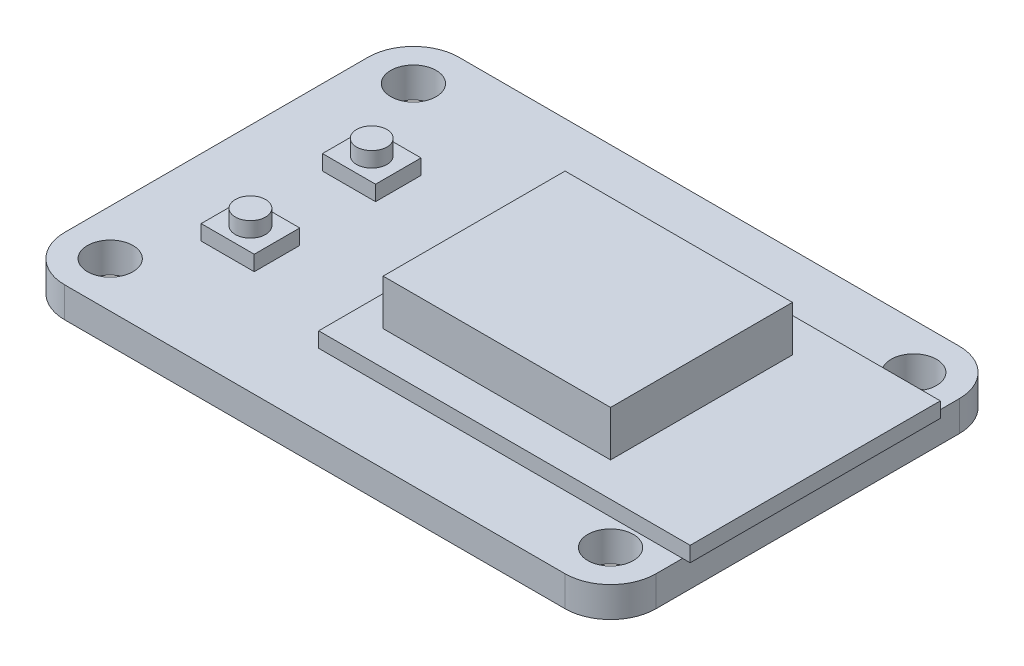
ISO-10303-21;
HEADER;
FILE_DESCRIPTION(('STEP AP214'),'2;1');
FILE_NAME('part.step','',(''),(''),'','','');
FILE_SCHEMA(('AUTOMOTIVE_DESIGN { 1 0 10303 214 1 1 1 1 }'));
ENDSEC;
DATA;
#1=APPLICATION_CONTEXT('core data for automotive mechanical design processes');
#2=APPLICATION_PROTOCOL_DEFINITION('international standard','automotive_design',2000,#1);
#3=PRODUCT_CONTEXT('',#1,'mechanical');
#4=PRODUCT('Part','Part','',(#3));
#5=PRODUCT_RELATED_PRODUCT_CATEGORY('part','',(#4));
#6=PRODUCT_DEFINITION_FORMATION('','',#4);
#7=PRODUCT_DEFINITION_CONTEXT('part definition',#1,'design');
#8=PRODUCT_DEFINITION('design','',#6,#7);
#9=PRODUCT_DEFINITION_SHAPE('','',#8);
#10=(LENGTH_UNIT() NAMED_UNIT(*) SI_UNIT(.MILLI.,.METRE.));
#11=(NAMED_UNIT(*) PLANE_ANGLE_UNIT() SI_UNIT($,.RADIAN.));
#12=(NAMED_UNIT(*) SI_UNIT($,.STERADIAN.) SOLID_ANGLE_UNIT());
#13=UNCERTAINTY_MEASURE_WITH_UNIT(LENGTH_MEASURE(1.E-05),#10,'distance_accuracy_value','');
#14=(GEOMETRIC_REPRESENTATION_CONTEXT(3) GLOBAL_UNCERTAINTY_ASSIGNED_CONTEXT((#13)) GLOBAL_UNIT_ASSIGNED_CONTEXT((#10,
#11,#12)) REPRESENTATION_CONTEXT('',''));
#15=CARTESIAN_POINT('',(0.,0.,0.));
#16=DIRECTION('',(0.,0.,1.));
#17=DIRECTION('',(1.,0.,0.));
#18=AXIS2_PLACEMENT_3D('',#15,#16,#17);
#19=CARTESIAN_POINT('',(0.,2.,0.));
#20=DIRECTION('',(0.,1.,0.));
#21=DIRECTION('',(0.,0.,1.));
#22=AXIS2_PLACEMENT_3D('',#19,#20,#21);
#23=PLANE('',#22);
#24=DIRECTION('',(0.,0.,-1.));
#25=VECTOR('',#24,1.);
#26=CARTESIAN_POINT('',(19.5,2.,-13.));
#27=LINE('',#26,#25);
#28=CARTESIAN_POINT('',(19.5,2.,-8.25));
#29=VERTEX_POINT('',#28);
#30=CARTESIAN_POINT('',(19.5,2.,-10.));
#31=VERTEX_POINT('',#30);
#32=EDGE_CURVE('E356',#29,#31,#27,.T.);
#33=ORIENTED_EDGE('',*,*,#32,.T.);
#34=CARTESIAN_POINT('',(16.5,2.,-10.));
#35=DIRECTION('',(0.,1.,0.));
#36=DIRECTION('',(0.,0.,1.));
#37=AXIS2_PLACEMENT_3D('',#34,#35,#36);
#38=CIRCLE('',#37,3.);
#39=CARTESIAN_POINT('',(16.5,2.,-13.));
#40=VERTEX_POINT('',#39);
#41=EDGE_CURVE('E396',#31,#40,#38,.T.);
#42=ORIENTED_EDGE('',*,*,#41,.T.);
#43=DIRECTION('',(-1.,0.,0.));
#44=VECTOR('',#43,1.);
#45=CARTESIAN_POINT('',(-19.5,2.,-13.));
#46=LINE('',#45,#44);
#47=CARTESIAN_POINT('',(-16.5,2.,-13.));
#48=VERTEX_POINT('',#47);
#49=EDGE_CURVE('E354',#40,#48,#46,.T.);
#50=ORIENTED_EDGE('',*,*,#49,.T.);
#51=CARTESIAN_POINT('',(-16.5,2.,-10.));
#52=DIRECTION('',(0.,1.,0.));
#53=DIRECTION('',(0.,0.,1.));
#54=AXIS2_PLACEMENT_3D('',#51,#52,#53);
#55=CIRCLE('',#54,3.);
#56=CARTESIAN_POINT('',(-19.5,2.,-10.));
#57=VERTEX_POINT('',#56);
#58=EDGE_CURVE('E392',#48,#57,#55,.T.);
#59=ORIENTED_EDGE('',*,*,#58,.T.);
#60=DIRECTION('',(0.,0.,1.));
#61=VECTOR('',#60,1.);
#62=CARTESIAN_POINT('',(-19.5,2.,-13.));
#63=LINE('',#62,#61);
#64=CARTESIAN_POINT('',(-19.5,2.,9.99999999999999));
#65=VERTEX_POINT('',#64);
#66=EDGE_CURVE('E359',#57,#65,#63,.T.);
#67=ORIENTED_EDGE('',*,*,#66,.T.);
#68=CARTESIAN_POINT('',(-16.5,2.,10.));
#69=DIRECTION('',(0.,1.,0.));
#70=DIRECTION('',(0.,0.,1.));
#71=AXIS2_PLACEMENT_3D('',#68,#69,#70);
#72=CIRCLE('',#71,3.);
#73=CARTESIAN_POINT('',(-16.5,2.,13.));
#74=VERTEX_POINT('',#73);
#75=EDGE_CURVE('E57',#65,#74,#72,.T.);
#76=ORIENTED_EDGE('',*,*,#75,.T.);
#77=DIRECTION('',(1.,0.,0.));
#78=VECTOR('',#77,1.);
#79=CARTESIAN_POINT('',(-19.5,2.,13.));
#80=LINE('',#79,#78);
#81=CARTESIAN_POINT('',(16.5,2.,13.));
#82=VERTEX_POINT('',#81);
#83=EDGE_CURVE('E361',#74,#82,#80,.T.);
#84=ORIENTED_EDGE('',*,*,#83,.T.);
#85=CARTESIAN_POINT('',(16.5,2.,10.));
#86=DIRECTION('',(0.,1.,0.));
#87=DIRECTION('',(0.,0.,1.));
#88=AXIS2_PLACEMENT_3D('',#85,#86,#87);
#89=CIRCLE('',#88,3.);
#90=CARTESIAN_POINT('',(19.5,2.,9.99999999999999));
#91=VERTEX_POINT('',#90);
#92=EDGE_CURVE('E394',#82,#91,#89,.T.);
#93=ORIENTED_EDGE('',*,*,#92,.T.);
#94=CARTESIAN_POINT('',(19.5,2.,8.24999999999999));
#95=VERTEX_POINT('',#94);
#96=EDGE_CURVE('E352',#91,#95,#27,.T.);
#97=ORIENTED_EDGE('',*,*,#96,.T.);
#98=DIRECTION('',(1.,0.,0.));
#99=VECTOR('',#98,1.);
#100=CARTESIAN_POINT('',(-4.49999999999999,2.,8.25));
#101=LINE('',#100,#99);
#102=CARTESIAN_POINT('',(-4.49999999999999,2.,8.25));
#103=VERTEX_POINT('',#102);
#104=EDGE_CURVE('E297',#103,#95,#101,.T.);
#105=ORIENTED_EDGE('',*,*,#104,.F.);
#106=DIRECTION('',(0.,0.,1.));
#107=VECTOR('',#106,1.);
#108=CARTESIAN_POINT('',(-4.5,2.,-8.25));
#109=LINE('',#108,#107);
#110=CARTESIAN_POINT('',(-4.5,2.,-8.25));
#111=VERTEX_POINT('',#110);
#112=EDGE_CURVE('E309',#111,#103,#109,.T.);
#113=ORIENTED_EDGE('',*,*,#112,.F.);
#114=DIRECTION('',(-1.,0.,0.));
#115=VECTOR('',#114,1.);
#116=CARTESIAN_POINT('',(-4.5,2.,-8.25));
#117=LINE('',#116,#115);
#118=EDGE_CURVE('E310',#29,#111,#117,.T.);
#119=ORIENTED_EDGE('',*,*,#118,.F.);
#120=EDGE_LOOP('',(#33,#42,#50,#59,#67,#76,#84,#93,#97,#105,#113,#119));
#121=FACE_BOUND('',#120,.T.);
#122=CARTESIAN_POINT('',(16.5,2.,-10.));
#123=DIRECTION('',(0.,1.,0.));
#124=DIRECTION('',(0.,0.,1.));
#125=AXIS2_PLACEMENT_3D('',#122,#123,#124);
#126=CIRCLE('',#125,1.5);
#127=CARTESIAN_POINT('',(16.5,2.,-8.5));
#128=VERTEX_POINT('',#127);
#129=EDGE_CURVE('E327',#128,#128,#126,.T.);
#130=ORIENTED_EDGE('',*,*,#129,.F.);
#131=EDGE_LOOP('',(#130));
#132=FACE_BOUND('',#131,.T.);
#133=CARTESIAN_POINT('',(16.5,2.,10.));
#134=DIRECTION('',(0.,1.,0.));
#135=DIRECTION('',(0.,0.,1.));
#136=AXIS2_PLACEMENT_3D('',#133,#134,#135);
#137=CIRCLE('',#136,1.5);
#138=CARTESIAN_POINT('',(16.5,2.,11.5));
#139=VERTEX_POINT('',#138);
#140=EDGE_CURVE('E331',#139,#139,#137,.T.);
#141=ORIENTED_EDGE('',*,*,#140,.F.);
#142=EDGE_LOOP('',(#141));
#143=FACE_BOUND('',#142,.T.);
#144=CARTESIAN_POINT('',(-16.5,2.,10.));
#145=DIRECTION('',(0.,1.,0.));
#146=DIRECTION('',(0.,0.,1.));
#147=AXIS2_PLACEMENT_3D('',#144,#145,#146);
#148=CIRCLE('',#147,1.5);
#149=CARTESIAN_POINT('',(-16.5,2.,11.5));
#150=VERTEX_POINT('',#149);
#151=EDGE_CURVE('E337',#150,#150,#148,.T.);
#152=ORIENTED_EDGE('',*,*,#151,.F.);
#153=EDGE_LOOP('',(#152));
#154=FACE_BOUND('',#153,.T.);
#155=CARTESIAN_POINT('',(-16.5,2.,-10.));
#156=DIRECTION('',(0.,1.,0.));
#157=DIRECTION('',(0.,0.,1.));
#158=AXIS2_PLACEMENT_3D('',#155,#156,#157);
#159=CIRCLE('',#158,1.5);
#160=CARTESIAN_POINT('',(-16.5,2.,-8.5));
#161=VERTEX_POINT('',#160);
#162=EDGE_CURVE('E343',#161,#161,#159,.T.);
#163=ORIENTED_EDGE('',*,*,#162,.F.);
#164=EDGE_LOOP('',(#163));
#165=FACE_BOUND('',#164,.T.);
#166=DIRECTION('',(-1.,0.,0.));
#167=VECTOR('',#166,1.);
#168=CARTESIAN_POINT('',(-14.5,2.,-5.));
#169=LINE('',#168,#167);
#170=CARTESIAN_POINT('',(-11.,2.,-5.));
#171=VERTEX_POINT('',#170);
#172=CARTESIAN_POINT('',(-14.5,2.,-5.));
#173=VERTEX_POINT('',#172);
#174=EDGE_CURVE('E232',#171,#173,#169,.T.);
#175=ORIENTED_EDGE('',*,*,#174,.F.);
#176=DIRECTION('',(0.,0.,-1.));
#177=VECTOR('',#176,1.);
#178=CARTESIAN_POINT('',(-11.,2.,-5.));
#179=LINE('',#178,#177);
#180=CARTESIAN_POINT('',(-11.,2.,-2.));
#181=VERTEX_POINT('',#180);
#182=EDGE_CURVE('E229',#181,#171,#179,.T.);
#183=ORIENTED_EDGE('',*,*,#182,.F.);
#184=DIRECTION('',(1.,0.,0.));
#185=VECTOR('',#184,1.);
#186=CARTESIAN_POINT('',(-14.5,2.,-2.));
#187=LINE('',#186,#185);
#188=CARTESIAN_POINT('',(-14.5,2.,-2.));
#189=VERTEX_POINT('',#188);
#190=EDGE_CURVE('E242',#189,#181,#187,.T.);
#191=ORIENTED_EDGE('',*,*,#190,.F.);
#192=DIRECTION('',(0.,0.,1.));
#193=VECTOR('',#192,1.);
#194=CARTESIAN_POINT('',(-14.5,2.,-5.));
#195=LINE('',#194,#193);
#196=EDGE_CURVE('E250',#173,#189,#195,.T.);
#197=ORIENTED_EDGE('',*,*,#196,.F.);
#198=EDGE_LOOP('',(#175,#183,#191,#197));
#199=FACE_BOUND('',#198,.T.);
#200=DIRECTION('',(-1.,0.,0.));
#201=VECTOR('',#200,1.);
#202=CARTESIAN_POINT('',(-14.5,2.,3.));
#203=LINE('',#202,#201);
#204=CARTESIAN_POINT('',(-11.,2.,3.));
#205=VERTEX_POINT('',#204);
#206=CARTESIAN_POINT('',(-14.5,2.,3.));
#207=VERTEX_POINT('',#206);
#208=EDGE_CURVE('E832',#205,#207,#203,.T.);
#209=ORIENTED_EDGE('',*,*,#208,.F.);
#210=DIRECTION('',(0.,0.,-1.));
#211=VECTOR('',#210,1.);
#212=CARTESIAN_POINT('',(-11.,2.,3.));
#213=LINE('',#212,#211);
#214=CARTESIAN_POINT('',(-11.,2.,6.));
#215=VERTEX_POINT('',#214);
#216=EDGE_CURVE('E227',#215,#205,#213,.T.);
#217=ORIENTED_EDGE('',*,*,#216,.F.);
#218=DIRECTION('',(1.,0.,0.));
#219=VECTOR('',#218,1.);
#220=CARTESIAN_POINT('',(-14.5,2.,6.));
#221=LINE('',#220,#219);
#222=CARTESIAN_POINT('',(-14.5,2.,6.));
#223=VERTEX_POINT('',#222);
#224=EDGE_CURVE('E223',#223,#215,#221,.T.);
#225=ORIENTED_EDGE('',*,*,#224,.F.);
#226=DIRECTION('',(0.,0.,1.));
#227=VECTOR('',#226,1.);
#228=CARTESIAN_POINT('',(-14.5,2.,3.));
#229=LINE('',#228,#227);
#230=EDGE_CURVE('E835',#207,#223,#229,.T.);
#231=ORIENTED_EDGE('',*,*,#230,.F.);
#232=EDGE_LOOP('',(#209,#217,#225,#231));
#233=FACE_BOUND('',#232,.T.);
#234=ADVANCED_FACE('F35',(#121,#132,#143,#154,#165,#199,#233),#23,.T.);
#235=CARTESIAN_POINT('',(0.,3.,0.));
#236=DIRECTION('',(0.,1.,0.));
#237=DIRECTION('',(0.,0.,1.));
#238=AXIS2_PLACEMENT_3D('',#235,#236,#237);
#239=PLANE('',#238);
#240=DIRECTION('',(0.,0.,-1.));
#241=VECTOR('',#240,1.);
#242=CARTESIAN_POINT('',(20.,3.,-8.25));
#243=LINE('',#242,#241);
#244=CARTESIAN_POINT('',(20.,3.,8.25));
#245=VERTEX_POINT('',#244);
#246=CARTESIAN_POINT('',(20.,3.,-8.25));
#247=VERTEX_POINT('',#246);
#248=EDGE_CURVE('E293',#245,#247,#243,.T.);
#249=ORIENTED_EDGE('',*,*,#248,.T.);
#250=DIRECTION('',(-1.,0.,0.));
#251=VECTOR('',#250,1.);
#252=CARTESIAN_POINT('',(-4.5,3.,-8.25));
#253=LINE('',#252,#251);
#254=CARTESIAN_POINT('',(-4.5,3.,-8.25));
#255=VERTEX_POINT('',#254);
#256=EDGE_CURVE('E296',#247,#255,#253,.T.);
#257=ORIENTED_EDGE('',*,*,#256,.T.);
#258=DIRECTION('',(0.,0.,1.));
#259=VECTOR('',#258,1.);
#260=CARTESIAN_POINT('',(-4.5,3.,-8.25));
#261=LINE('',#260,#259);
#262=CARTESIAN_POINT('',(-4.49999999999999,3.,8.25));
#263=VERTEX_POINT('',#262);
#264=EDGE_CURVE('E299',#255,#263,#261,.T.);
#265=ORIENTED_EDGE('',*,*,#264,.T.);
#266=DIRECTION('',(1.,0.,0.));
#267=VECTOR('',#266,1.);
#268=CARTESIAN_POINT('',(-4.49999999999999,3.,8.25));
#269=LINE('',#268,#267);
#270=EDGE_CURVE('E301',#263,#245,#269,.T.);
#271=ORIENTED_EDGE('',*,*,#270,.T.);
#272=EDGE_LOOP('',(#249,#257,#265,#271));
#273=FACE_BOUND('',#272,.T.);
#274=DIRECTION('',(-1.,0.,0.));
#275=VECTOR('',#274,1.);
#276=CARTESIAN_POINT('',(-2.5,3.,-6.));
#277=LINE('',#276,#275);
#278=CARTESIAN_POINT('',(12.5,3.,-6.));
#279=VERTEX_POINT('',#278);
#280=CARTESIAN_POINT('',(-2.5,3.,-6.));
#281=VERTEX_POINT('',#280);
#282=EDGE_CURVE('E277',#279,#281,#277,.T.);
#283=ORIENTED_EDGE('',*,*,#282,.F.);
#284=DIRECTION('',(0.,0.,-1.));
#285=VECTOR('',#284,1.);
#286=CARTESIAN_POINT('',(12.5,3.,-6.));
#287=LINE('',#286,#285);
#288=CARTESIAN_POINT('',(12.5,3.,6.));
#289=VERTEX_POINT('',#288);
#290=EDGE_CURVE('E263',#289,#279,#287,.T.);
#291=ORIENTED_EDGE('',*,*,#290,.F.);
#292=DIRECTION('',(1.,0.,0.));
#293=VECTOR('',#292,1.);
#294=CARTESIAN_POINT('',(-2.5,3.,6.));
#295=LINE('',#294,#293);
#296=CARTESIAN_POINT('',(-2.5,3.,6.));
#297=VERTEX_POINT('',#296);
#298=EDGE_CURVE('E268',#297,#289,#295,.T.);
#299=ORIENTED_EDGE('',*,*,#298,.F.);
#300=DIRECTION('',(0.,0.,1.));
#301=VECTOR('',#300,1.);
#302=CARTESIAN_POINT('',(-2.5,3.,-6.));
#303=LINE('',#302,#301);
#304=EDGE_CURVE('E279',#281,#297,#303,.T.);
#305=ORIENTED_EDGE('',*,*,#304,.F.);
#306=EDGE_LOOP('',(#283,#291,#299,#305));
#307=FACE_BOUND('',#306,.T.);
#308=ADVANCED_FACE('F442',(#273,#307),#239,.T.);
#309=CARTESIAN_POINT('',(19.5,2.,-13.));
#310=DIRECTION('',(-1.,0.,0.));
#311=DIRECTION('',(0.,0.,1.));
#312=AXIS2_PLACEMENT_3D('',#309,#310,#311);
#313=PLANE('',#312);
#314=DIRECTION('',(0.,0.,-1.));
#315=VECTOR('',#314,1.);
#316=CARTESIAN_POINT('',(19.5,0.,-13.));
#317=LINE('',#316,#315);
#318=CARTESIAN_POINT('',(19.5,0.,9.99999999999999));
#319=VERTEX_POINT('',#318);
#320=CARTESIAN_POINT('',(19.5,0.,-10.));
#321=VERTEX_POINT('',#320);
#322=EDGE_CURVE('E349',#319,#321,#317,.T.);
#323=ORIENTED_EDGE('',*,*,#322,.T.);
#324=DIRECTION('',(0.,-1.,0.));
#325=VECTOR('',#324,1.);
#326=CARTESIAN_POINT('',(19.5,2.,-10.));
#327=LINE('',#326,#325);
#328=EDGE_CURVE('E389',#321,#31,#327,.F.);
#329=ORIENTED_EDGE('',*,*,#328,.T.);
#330=ORIENTED_EDGE('',*,*,#32,.F.);
#331=EDGE_CURVE('E355',#95,#29,#27,.T.);
#332=ORIENTED_EDGE('',*,*,#331,.F.);
#333=ORIENTED_EDGE('',*,*,#96,.F.);
#334=DIRECTION('',(0.,-1.,0.));
#335=VECTOR('',#334,1.);
#336=CARTESIAN_POINT('',(19.5,2.,10.));
#337=LINE('',#336,#335);
#338=EDGE_CURVE('E386',#91,#319,#337,.T.);
#339=ORIENTED_EDGE('',*,*,#338,.T.);
#340=EDGE_LOOP('',(#323,#329,#330,#332,#333,#339));
#341=FACE_BOUND('',#340,.T.);
#342=ADVANCED_FACE('F424',(#341),#313,.F.);
#343=CARTESIAN_POINT('',(-19.5,2.,-13.));
#344=DIRECTION('',(0.,0.,1.));
#345=DIRECTION('',(1.,0.,0.));
#346=AXIS2_PLACEMENT_3D('',#343,#344,#345);
#347=PLANE('',#346);
#348=ORIENTED_EDGE('',*,*,#49,.F.);
#349=DIRECTION('',(0.,-1.,0.));
#350=VECTOR('',#349,1.);
#351=CARTESIAN_POINT('',(16.5,2.,-13.));
#352=LINE('',#351,#350);
#353=CARTESIAN_POINT('',(16.5,0.,-13.));
#354=VERTEX_POINT('',#353);
#355=EDGE_CURVE('E375',#40,#354,#352,.T.);
#356=ORIENTED_EDGE('',*,*,#355,.T.);
#357=DIRECTION('',(-1.,0.,0.));
#358=VECTOR('',#357,1.);
#359=CARTESIAN_POINT('',(-19.5,0.,-13.));
#360=LINE('',#359,#358);
#361=CARTESIAN_POINT('',(-16.5,0.,-13.));
#362=VERTEX_POINT('',#361);
#363=EDGE_CURVE('E365',#354,#362,#360,.T.);
#364=ORIENTED_EDGE('',*,*,#363,.T.);
#365=DIRECTION('',(0.,-1.,0.));
#366=VECTOR('',#365,1.);
#367=CARTESIAN_POINT('',(-16.5,2.,-13.));
#368=LINE('',#367,#366);
#369=EDGE_CURVE('E373',#362,#48,#368,.F.);
#370=ORIENTED_EDGE('',*,*,#369,.T.);
#371=EDGE_LOOP('',(#348,#356,#364,#370));
#372=FACE_BOUND('',#371,.T.);
#373=ADVANCED_FACE('F480',(#372),#347,.F.);
#374=CARTESIAN_POINT('',(-19.5,2.,-13.));
#375=DIRECTION('',(1.,0.,0.));
#376=DIRECTION('',(0.,0.,-1.));
#377=AXIS2_PLACEMENT_3D('',#374,#375,#376);
#378=PLANE('',#377);
#379=ORIENTED_EDGE('',*,*,#66,.F.);
#380=DIRECTION('',(0.,-1.,0.));
#381=VECTOR('',#380,1.);
#382=CARTESIAN_POINT('',(-19.5,2.,-10.));
#383=LINE('',#382,#381);
#384=CARTESIAN_POINT('',(-19.5,0.,-10.));
#385=VERTEX_POINT('',#384);
#386=EDGE_CURVE('E11',#57,#385,#383,.T.);
#387=ORIENTED_EDGE('',*,*,#386,.T.);
#388=DIRECTION('',(0.,0.,1.));
#389=VECTOR('',#388,1.);
#390=CARTESIAN_POINT('',(-19.5,0.,-13.));
#391=LINE('',#390,#389);
#392=CARTESIAN_POINT('',(-19.5,0.,9.99999999999999));
#393=VERTEX_POINT('',#392);
#394=EDGE_CURVE('E368',#385,#393,#391,.T.);
#395=ORIENTED_EDGE('',*,*,#394,.T.);
#396=DIRECTION('',(0.,-1.,0.));
#397=VECTOR('',#396,1.);
#398=CARTESIAN_POINT('',(-19.5,2.,10.));
#399=LINE('',#398,#397);
#400=EDGE_CURVE('E43',#393,#65,#399,.F.);
#401=ORIENTED_EDGE('',*,*,#400,.T.);
#402=EDGE_LOOP('',(#379,#387,#395,#401));
#403=FACE_BOUND('',#402,.T.);
#404=ADVANCED_FACE('F404',(#403),#378,.F.);
#405=CARTESIAN_POINT('',(-19.5,2.,13.));
#406=DIRECTION('',(0.,0.,-1.));
#407=DIRECTION('',(-1.,0.,0.));
#408=AXIS2_PLACEMENT_3D('',#405,#406,#407);
#409=PLANE('',#408);
#410=DIRECTION('',(1.,0.,0.));
#411=VECTOR('',#410,1.);
#412=CARTESIAN_POINT('',(-19.5,0.,13.));
#413=LINE('',#412,#411);
#414=CARTESIAN_POINT('',(-16.5,0.,13.));
#415=VERTEX_POINT('',#414);
#416=CARTESIAN_POINT('',(16.5,0.,13.));
#417=VERTEX_POINT('',#416);
#418=EDGE_CURVE('E371',#415,#417,#413,.T.);
#419=ORIENTED_EDGE('',*,*,#418,.T.);
#420=DIRECTION('',(0.,-1.,0.));
#421=VECTOR('',#420,1.);
#422=CARTESIAN_POINT('',(16.5,2.,13.));
#423=LINE('',#422,#421);
#424=EDGE_CURVE('E50',#417,#82,#423,.F.);
#425=ORIENTED_EDGE('',*,*,#424,.T.);
#426=ORIENTED_EDGE('',*,*,#83,.F.);
#427=DIRECTION('',(0.,-1.,0.));
#428=VECTOR('',#427,1.);
#429=CARTESIAN_POINT('',(-16.5,2.,13.));
#430=LINE('',#429,#428);
#431=EDGE_CURVE('E398',#74,#415,#430,.T.);
#432=ORIENTED_EDGE('',*,*,#431,.T.);
#433=EDGE_LOOP('',(#419,#425,#426,#432));
#434=FACE_BOUND('',#433,.T.);
#435=ADVANCED_FACE('F413',(#434),#409,.F.);
#436=CARTESIAN_POINT('',(0.,0.,0.));
#437=DIRECTION('',(0.,1.,0.));
#438=DIRECTION('',(0.,0.,1.));
#439=AXIS2_PLACEMENT_3D('',#436,#437,#438);
#440=PLANE('',#439);
#441=CARTESIAN_POINT('',(16.5,0.,-10.));
#442=DIRECTION('',(0.,1.,0.));
#443=DIRECTION('',(0.,0.,1.));
#444=AXIS2_PLACEMENT_3D('',#441,#442,#443);
#445=CIRCLE('',#444,1.5);
#446=CARTESIAN_POINT('',(16.5,0.,-8.5));
#447=VERTEX_POINT('',#446);
#448=EDGE_CURVE('E328',#447,#447,#445,.T.);
#449=ORIENTED_EDGE('',*,*,#448,.T.);
#450=EDGE_LOOP('',(#449));
#451=FACE_BOUND('',#450,.T.);
#452=CARTESIAN_POINT('',(16.5,0.,10.));
#453=DIRECTION('',(0.,1.,0.));
#454=DIRECTION('',(0.,0.,1.));
#455=AXIS2_PLACEMENT_3D('',#452,#453,#454);
#456=CIRCLE('',#455,1.5);
#457=CARTESIAN_POINT('',(16.5,0.,11.5));
#458=VERTEX_POINT('',#457);
#459=EDGE_CURVE('E334',#458,#458,#456,.T.);
#460=ORIENTED_EDGE('',*,*,#459,.T.);
#461=EDGE_LOOP('',(#460));
#462=FACE_BOUND('',#461,.T.);
#463=CARTESIAN_POINT('',(-16.5,0.,10.));
#464=DIRECTION('',(0.,1.,0.));
#465=DIRECTION('',(0.,0.,1.));
#466=AXIS2_PLACEMENT_3D('',#463,#464,#465);
#467=CIRCLE('',#466,1.5);
#468=CARTESIAN_POINT('',(-16.5,0.,11.5));
#469=VERTEX_POINT('',#468);
#470=EDGE_CURVE('E340',#469,#469,#467,.T.);
#471=ORIENTED_EDGE('',*,*,#470,.T.);
#472=EDGE_LOOP('',(#471));
#473=FACE_BOUND('',#472,.T.);
#474=CARTESIAN_POINT('',(-16.5,0.,-10.));
#475=DIRECTION('',(0.,1.,0.));
#476=DIRECTION('',(0.,0.,1.));
#477=AXIS2_PLACEMENT_3D('',#474,#475,#476);
#478=CIRCLE('',#477,1.5);
#479=CARTESIAN_POINT('',(-16.5,0.,-8.5));
#480=VERTEX_POINT('',#479);
#481=EDGE_CURVE('E346',#480,#480,#478,.T.);
#482=ORIENTED_EDGE('',*,*,#481,.T.);
#483=EDGE_LOOP('',(#482));
#484=FACE_BOUND('',#483,.T.);
#485=ORIENTED_EDGE('',*,*,#363,.F.);
#486=CARTESIAN_POINT('',(16.5,0.,-10.));
#487=DIRECTION('',(0.,1.,0.));
#488=DIRECTION('',(0.,0.,1.));
#489=AXIS2_PLACEMENT_3D('',#486,#487,#488);
#490=CIRCLE('',#489,3.);
#491=EDGE_CURVE('E384',#354,#321,#490,.F.);
#492=ORIENTED_EDGE('',*,*,#491,.T.);
#493=ORIENTED_EDGE('',*,*,#322,.F.);
#494=CARTESIAN_POINT('',(16.5,0.,10.));
#495=DIRECTION('',(0.,1.,0.));
#496=DIRECTION('',(0.,0.,1.));
#497=AXIS2_PLACEMENT_3D('',#494,#495,#496);
#498=CIRCLE('',#497,3.);
#499=EDGE_CURVE('E382',#319,#417,#498,.F.);
#500=ORIENTED_EDGE('',*,*,#499,.T.);
#501=ORIENTED_EDGE('',*,*,#418,.F.);
#502=CARTESIAN_POINT('',(-16.5,0.,10.));
#503=DIRECTION('',(0.,1.,0.));
#504=DIRECTION('',(0.,0.,1.));
#505=AXIS2_PLACEMENT_3D('',#502,#503,#504);
#506=CIRCLE('',#505,3.);
#507=EDGE_CURVE('E378',#415,#393,#506,.F.);
#508=ORIENTED_EDGE('',*,*,#507,.T.);
#509=ORIENTED_EDGE('',*,*,#394,.F.);
#510=CARTESIAN_POINT('',(-16.5,0.,-10.));
#511=DIRECTION('',(0.,1.,0.));
#512=DIRECTION('',(0.,0.,1.));
#513=AXIS2_PLACEMENT_3D('',#510,#511,#512);
#514=CIRCLE('',#513,3.);
#515=EDGE_CURVE('E380',#385,#362,#514,.F.);
#516=ORIENTED_EDGE('',*,*,#515,.T.);
#517=EDGE_LOOP('',(#485,#492,#493,#500,#501,#508,#509,#516));
#518=FACE_BOUND('',#517,.T.);
#519=ADVANCED_FACE('F416',(#451,#462,#473,#484,#518),#440,.F.);
#520=CARTESIAN_POINT('',(-16.5,0.,-10.));
#521=DIRECTION('',(0.,1.,0.));
#522=DIRECTION('',(0.,0.,1.));
#523=AXIS2_PLACEMENT_3D('',#520,#521,#522);
#524=CYLINDRICAL_SURFACE('',#523,1.5);
#525=ORIENTED_EDGE('',*,*,#481,.F.);
#526=EDGE_LOOP('',(#525));
#527=FACE_BOUND('',#526,.T.);
#528=ORIENTED_EDGE('',*,*,#162,.T.);
#529=EDGE_LOOP('',(#528));
#530=FACE_BOUND('',#529,.T.);
#531=ADVANCED_FACE('F471',(#527,#530),#524,.F.);
#532=CARTESIAN_POINT('',(-16.5,0.,10.));
#533=DIRECTION('',(0.,1.,0.));
#534=DIRECTION('',(0.,0.,1.));
#535=AXIS2_PLACEMENT_3D('',#532,#533,#534);
#536=CYLINDRICAL_SURFACE('',#535,1.5);
#537=ORIENTED_EDGE('',*,*,#470,.F.);
#538=EDGE_LOOP('',(#537));
#539=FACE_BOUND('',#538,.T.);
#540=ORIENTED_EDGE('',*,*,#151,.T.);
#541=EDGE_LOOP('',(#540));
#542=FACE_BOUND('',#541,.T.);
#543=ADVANCED_FACE('F798',(#539,#542),#536,.F.);
#544=CARTESIAN_POINT('',(16.5,0.,10.));
#545=DIRECTION('',(0.,1.,0.));
#546=DIRECTION('',(0.,0.,1.));
#547=AXIS2_PLACEMENT_3D('',#544,#545,#546);
#548=CYLINDRICAL_SURFACE('',#547,1.5);
#549=ORIENTED_EDGE('',*,*,#459,.F.);
#550=EDGE_LOOP('',(#549));
#551=FACE_BOUND('',#550,.T.);
#552=ORIENTED_EDGE('',*,*,#140,.T.);
#553=EDGE_LOOP('',(#552));
#554=FACE_BOUND('',#553,.T.);
#555=ADVANCED_FACE('F787',(#551,#554),#548,.F.);
#556=CARTESIAN_POINT('',(16.5,0.,-10.));
#557=DIRECTION('',(0.,1.,0.));
#558=DIRECTION('',(0.,0.,1.));
#559=AXIS2_PLACEMENT_3D('',#556,#557,#558);
#560=CYLINDRICAL_SURFACE('',#559,1.5);
#561=ORIENTED_EDGE('',*,*,#448,.F.);
#562=EDGE_LOOP('',(#561));
#563=FACE_BOUND('',#562,.T.);
#564=ORIENTED_EDGE('',*,*,#129,.T.);
#565=EDGE_LOOP('',(#564));
#566=FACE_BOUND('',#565,.T.);
#567=ADVANCED_FACE('F460',(#563,#566),#560,.F.);
#568=CARTESIAN_POINT('',(0.,2.,0.));
#569=DIRECTION('',(0.,1.,0.));
#570=DIRECTION('',(0.,0.,1.));
#571=AXIS2_PLACEMENT_3D('',#568,#569,#570);
#572=PLANE('',#571);
#573=CARTESIAN_POINT('',(20.,2.,8.25));
#574=VERTEX_POINT('',#573);
#575=EDGE_CURVE('E313',#95,#574,#101,.T.);
#576=ORIENTED_EDGE('',*,*,#575,.F.);
#577=ORIENTED_EDGE('',*,*,#331,.T.);
#578=CARTESIAN_POINT('',(20.,2.,-8.25));
#579=VERTEX_POINT('',#578);
#580=EDGE_CURVE('E306',#579,#29,#117,.T.);
#581=ORIENTED_EDGE('',*,*,#580,.F.);
#582=DIRECTION('',(0.,0.,-1.));
#583=VECTOR('',#582,1.);
#584=CARTESIAN_POINT('',(20.,2.,-8.25));
#585=LINE('',#584,#583);
#586=EDGE_CURVE('E292',#574,#579,#585,.T.);
#587=ORIENTED_EDGE('',*,*,#586,.F.);
#588=EDGE_LOOP('',(#576,#577,#581,#587));
#589=FACE_BOUND('',#588,.T.);
#590=ADVANCED_FACE('F449',(#589),#572,.F.);
#591=CARTESIAN_POINT('',(20.,3.,-8.25));
#592=DIRECTION('',(-1.,0.,0.));
#593=DIRECTION('',(0.,0.,1.));
#594=AXIS2_PLACEMENT_3D('',#591,#592,#593);
#595=PLANE('',#594);
#596=ORIENTED_EDGE('',*,*,#586,.T.);
#597=DIRECTION('',(0.,-1.,0.));
#598=VECTOR('',#597,1.);
#599=CARTESIAN_POINT('',(20.,3.,-8.25));
#600=LINE('',#599,#598);
#601=EDGE_CURVE('E324',#247,#579,#600,.T.);
#602=ORIENTED_EDGE('',*,*,#601,.F.);
#603=ORIENTED_EDGE('',*,*,#248,.F.);
#604=DIRECTION('',(0.,-1.,0.));
#605=VECTOR('',#604,1.);
#606=CARTESIAN_POINT('',(20.,3.,8.25));
#607=LINE('',#606,#605);
#608=EDGE_CURVE('E303',#245,#574,#607,.T.);
#609=ORIENTED_EDGE('',*,*,#608,.T.);
#610=EDGE_LOOP('',(#596,#602,#603,#609));
#611=FACE_BOUND('',#610,.T.);
#612=ADVANCED_FACE('F452',(#611),#595,.F.);
#613=CARTESIAN_POINT('',(-4.5,3.,-8.25));
#614=DIRECTION('',(0.,0.,1.));
#615=DIRECTION('',(1.,0.,0.));
#616=AXIS2_PLACEMENT_3D('',#613,#614,#615);
#617=PLANE('',#616);
#618=ORIENTED_EDGE('',*,*,#580,.T.);
#619=ORIENTED_EDGE('',*,*,#118,.T.);
#620=DIRECTION('',(0.,-1.,0.));
#621=VECTOR('',#620,1.);
#622=CARTESIAN_POINT('',(-4.5,3.,-8.25));
#623=LINE('',#622,#621);
#624=EDGE_CURVE('E321',#255,#111,#623,.T.);
#625=ORIENTED_EDGE('',*,*,#624,.F.);
#626=ORIENTED_EDGE('',*,*,#256,.F.);
#627=ORIENTED_EDGE('',*,*,#601,.T.);
#628=EDGE_LOOP('',(#618,#619,#625,#626,#627));
#629=FACE_BOUND('',#628,.T.);
#630=ADVANCED_FACE('F446',(#629),#617,.F.);
#631=CARTESIAN_POINT('',(-4.5,3.,-8.25));
#632=DIRECTION('',(1.,0.,0.));
#633=DIRECTION('',(0.,0.,-1.));
#634=AXIS2_PLACEMENT_3D('',#631,#632,#633);
#635=PLANE('',#634);
#636=ORIENTED_EDGE('',*,*,#112,.T.);
#637=DIRECTION('',(0.,-1.,0.));
#638=VECTOR('',#637,1.);
#639=CARTESIAN_POINT('',(-4.49999999999999,3.,8.25));
#640=LINE('',#639,#638);
#641=EDGE_CURVE('E318',#263,#103,#640,.T.);
#642=ORIENTED_EDGE('',*,*,#641,.F.);
#643=ORIENTED_EDGE('',*,*,#264,.F.);
#644=ORIENTED_EDGE('',*,*,#624,.T.);
#645=EDGE_LOOP('',(#636,#642,#643,#644));
#646=FACE_BOUND('',#645,.T.);
#647=ADVANCED_FACE('F434',(#646),#635,.F.);
#648=CARTESIAN_POINT('',(-4.49999999999999,3.,8.25));
#649=DIRECTION('',(0.,0.,-1.));
#650=DIRECTION('',(-1.,0.,0.));
#651=AXIS2_PLACEMENT_3D('',#648,#649,#650);
#652=PLANE('',#651);
#653=ORIENTED_EDGE('',*,*,#104,.T.);
#654=ORIENTED_EDGE('',*,*,#575,.T.);
#655=ORIENTED_EDGE('',*,*,#608,.F.);
#656=ORIENTED_EDGE('',*,*,#270,.F.);
#657=ORIENTED_EDGE('',*,*,#641,.T.);
#658=EDGE_LOOP('',(#653,#654,#655,#656,#657));
#659=FACE_BOUND('',#658,.T.);
#660=ADVANCED_FACE('F438',(#659),#652,.F.);
#661=CARTESIAN_POINT('',(12.5,6.,-6.));
#662=DIRECTION('',(-1.,0.,0.));
#663=DIRECTION('',(0.,0.,1.));
#664=AXIS2_PLACEMENT_3D('',#661,#662,#663);
#665=PLANE('',#664);
#666=ORIENTED_EDGE('',*,*,#290,.T.);
#667=DIRECTION('',(0.,-1.,0.));
#668=VECTOR('',#667,1.);
#669=CARTESIAN_POINT('',(12.5,6.,-6.));
#670=LINE('',#669,#668);
#671=CARTESIAN_POINT('',(12.5,6.,-6.));
#672=VERTEX_POINT('',#671);
#673=EDGE_CURVE('E290',#672,#279,#670,.T.);
#674=ORIENTED_EDGE('',*,*,#673,.F.);
#675=DIRECTION('',(0.,0.,-1.));
#676=VECTOR('',#675,1.);
#677=CARTESIAN_POINT('',(12.5,6.,-6.));
#678=LINE('',#677,#676);
#679=CARTESIAN_POINT('',(12.5,6.,6.));
#680=VERTEX_POINT('',#679);
#681=EDGE_CURVE('E264',#680,#672,#678,.T.);
#682=ORIENTED_EDGE('',*,*,#681,.F.);
#683=DIRECTION('',(0.,-1.,0.));
#684=VECTOR('',#683,1.);
#685=CARTESIAN_POINT('',(12.5,6.,6.));
#686=LINE('',#685,#684);
#687=EDGE_CURVE('E274',#680,#289,#686,.T.);
#688=ORIENTED_EDGE('',*,*,#687,.T.);
#689=EDGE_LOOP('',(#666,#674,#682,#688));
#690=FACE_BOUND('',#689,.T.);
#691=ADVANCED_FACE('F729',(#690),#665,.F.);
#692=CARTESIAN_POINT('',(-2.5,6.,-6.));
#693=DIRECTION('',(0.,0.,1.));
#694=DIRECTION('',(1.,0.,0.));
#695=AXIS2_PLACEMENT_3D('',#692,#693,#694);
#696=PLANE('',#695);
#697=ORIENTED_EDGE('',*,*,#282,.T.);
#698=DIRECTION('',(0.,-1.,0.));
#699=VECTOR('',#698,1.);
#700=CARTESIAN_POINT('',(-2.5,6.,-6.));
#701=LINE('',#700,#699);
#702=CARTESIAN_POINT('',(-2.5,6.,-6.));
#703=VERTEX_POINT('',#702);
#704=EDGE_CURVE('E287',#703,#281,#701,.T.);
#705=ORIENTED_EDGE('',*,*,#704,.F.);
#706=DIRECTION('',(-1.,0.,0.));
#707=VECTOR('',#706,1.);
#708=CARTESIAN_POINT('',(-2.5,6.,-6.));
#709=LINE('',#708,#707);
#710=EDGE_CURVE('E267',#672,#703,#709,.T.);
#711=ORIENTED_EDGE('',*,*,#710,.F.);
#712=ORIENTED_EDGE('',*,*,#673,.T.);
#713=EDGE_LOOP('',(#697,#705,#711,#712));
#714=FACE_BOUND('',#713,.T.);
#715=ADVANCED_FACE('F719',(#714),#696,.F.);
#716=CARTESIAN_POINT('',(-2.5,6.,-6.));
#717=DIRECTION('',(1.,0.,0.));
#718=DIRECTION('',(0.,0.,-1.));
#719=AXIS2_PLACEMENT_3D('',#716,#717,#718);
#720=PLANE('',#719);
#721=ORIENTED_EDGE('',*,*,#304,.T.);
#722=DIRECTION('',(0.,-1.,0.));
#723=VECTOR('',#722,1.);
#724=CARTESIAN_POINT('',(-2.5,6.,6.));
#725=LINE('',#724,#723);
#726=CARTESIAN_POINT('',(-2.5,6.,6.));
#727=VERTEX_POINT('',#726);
#728=EDGE_CURVE('E285',#727,#297,#725,.T.);
#729=ORIENTED_EDGE('',*,*,#728,.F.);
#730=DIRECTION('',(0.,0.,1.));
#731=VECTOR('',#730,1.);
#732=CARTESIAN_POINT('',(-2.5,6.,-6.));
#733=LINE('',#732,#731);
#734=EDGE_CURVE('E270',#703,#727,#733,.T.);
#735=ORIENTED_EDGE('',*,*,#734,.F.);
#736=ORIENTED_EDGE('',*,*,#704,.T.);
#737=EDGE_LOOP('',(#721,#729,#735,#736));
#738=FACE_BOUND('',#737,.T.);
#739=ADVANCED_FACE('F709',(#738),#720,.F.);
#740=CARTESIAN_POINT('',(-2.5,6.,6.));
#741=DIRECTION('',(0.,0.,-1.));
#742=DIRECTION('',(-1.,0.,0.));
#743=AXIS2_PLACEMENT_3D('',#740,#741,#742);
#744=PLANE('',#743);
#745=ORIENTED_EDGE('',*,*,#298,.T.);
#746=ORIENTED_EDGE('',*,*,#687,.F.);
#747=DIRECTION('',(1.,0.,0.));
#748=VECTOR('',#747,1.);
#749=CARTESIAN_POINT('',(-2.5,6.,6.));
#750=LINE('',#749,#748);
#751=EDGE_CURVE('E272',#727,#680,#750,.T.);
#752=ORIENTED_EDGE('',*,*,#751,.F.);
#753=ORIENTED_EDGE('',*,*,#728,.T.);
#754=EDGE_LOOP('',(#745,#746,#752,#753));
#755=FACE_BOUND('',#754,.T.);
#756=ADVANCED_FACE('F699',(#755),#744,.F.);
#757=CARTESIAN_POINT('',(0.,6.,0.));
#758=DIRECTION('',(0.,1.,0.));
#759=DIRECTION('',(0.,0.,1.));
#760=AXIS2_PLACEMENT_3D('',#757,#758,#759);
#761=PLANE('',#760);
#762=ORIENTED_EDGE('',*,*,#681,.T.);
#763=ORIENTED_EDGE('',*,*,#710,.T.);
#764=ORIENTED_EDGE('',*,*,#734,.T.);
#765=ORIENTED_EDGE('',*,*,#751,.T.);
#766=EDGE_LOOP('',(#762,#763,#764,#765));
#767=FACE_BOUND('',#766,.T.);
#768=ADVANCED_FACE('F690',(#767),#761,.T.);
#769=CARTESIAN_POINT('',(-11.,3.,-5.));
#770=DIRECTION('',(-1.,0.,0.));
#771=DIRECTION('',(0.,0.,1.));
#772=AXIS2_PLACEMENT_3D('',#769,#770,#771);
#773=PLANE('',#772);
#774=ORIENTED_EDGE('',*,*,#182,.T.);
#775=DIRECTION('',(0.,-1.,0.));
#776=VECTOR('',#775,1.);
#777=CARTESIAN_POINT('',(-11.,3.,-5.));
#778=LINE('',#777,#776);
#779=CARTESIAN_POINT('',(-11.,3.,-5.));
#780=VERTEX_POINT('',#779);
#781=EDGE_CURVE('E261',#780,#171,#778,.T.);
#782=ORIENTED_EDGE('',*,*,#781,.F.);
#783=DIRECTION('',(0.,0.,-1.));
#784=VECTOR('',#783,1.);
#785=CARTESIAN_POINT('',(-11.,3.,-5.));
#786=LINE('',#785,#784);
#787=CARTESIAN_POINT('',(-11.,3.,-2.));
#788=VERTEX_POINT('',#787);
#789=EDGE_CURVE('E238',#788,#780,#786,.T.);
#790=ORIENTED_EDGE('',*,*,#789,.F.);
#791=DIRECTION('',(0.,-1.,0.));
#792=VECTOR('',#791,1.);
#793=CARTESIAN_POINT('',(-11.,3.,-2.));
#794=LINE('',#793,#792);
#795=EDGE_CURVE('E247',#788,#181,#794,.T.);
#796=ORIENTED_EDGE('',*,*,#795,.T.);
#797=EDGE_LOOP('',(#774,#782,#790,#796));
#798=FACE_BOUND('',#797,.T.);
#799=ADVANCED_FACE('F681',(#798),#773,.F.);
#800=CARTESIAN_POINT('',(-14.5,3.,-5.));
#801=DIRECTION('',(0.,0.,1.));
#802=DIRECTION('',(1.,0.,0.));
#803=AXIS2_PLACEMENT_3D('',#800,#801,#802);
#804=PLANE('',#803);
#805=ORIENTED_EDGE('',*,*,#174,.T.);
#806=DIRECTION('',(0.,-1.,0.));
#807=VECTOR('',#806,1.);
#808=CARTESIAN_POINT('',(-14.5,3.,-5.));
#809=LINE('',#808,#807);
#810=CARTESIAN_POINT('',(-14.5,3.,-5.));
#811=VERTEX_POINT('',#810);
#812=EDGE_CURVE('E258',#811,#173,#809,.T.);
#813=ORIENTED_EDGE('',*,*,#812,.F.);
#814=DIRECTION('',(-1.,0.,0.));
#815=VECTOR('',#814,1.);
#816=CARTESIAN_POINT('',(-14.5,3.,-5.));
#817=LINE('',#816,#815);
#818=EDGE_CURVE('E241',#780,#811,#817,.T.);
#819=ORIENTED_EDGE('',*,*,#818,.F.);
#820=ORIENTED_EDGE('',*,*,#781,.T.);
#821=EDGE_LOOP('',(#805,#813,#819,#820));
#822=FACE_BOUND('',#821,.T.);
#823=ADVANCED_FACE('F671',(#822),#804,.F.);
#824=CARTESIAN_POINT('',(-14.5,3.,-5.));
#825=DIRECTION('',(1.,0.,0.));
#826=DIRECTION('',(0.,0.,-1.));
#827=AXIS2_PLACEMENT_3D('',#824,#825,#826);
#828=PLANE('',#827);
#829=ORIENTED_EDGE('',*,*,#196,.T.);
#830=DIRECTION('',(0.,-1.,0.));
#831=VECTOR('',#830,1.);
#832=CARTESIAN_POINT('',(-14.5,3.,-2.));
#833=LINE('',#832,#831);
#834=CARTESIAN_POINT('',(-14.5,3.,-2.));
#835=VERTEX_POINT('',#834);
#836=EDGE_CURVE('E256',#835,#189,#833,.T.);
#837=ORIENTED_EDGE('',*,*,#836,.F.);
#838=DIRECTION('',(0.,0.,1.));
#839=VECTOR('',#838,1.);
#840=CARTESIAN_POINT('',(-14.5,3.,-5.));
#841=LINE('',#840,#839);
#842=EDGE_CURVE('E244',#811,#835,#841,.T.);
#843=ORIENTED_EDGE('',*,*,#842,.F.);
#844=ORIENTED_EDGE('',*,*,#812,.T.);
#845=EDGE_LOOP('',(#829,#837,#843,#844));
#846=FACE_BOUND('',#845,.T.);
#847=ADVANCED_FACE('F661',(#846),#828,.F.);
#848=CARTESIAN_POINT('',(-14.5,3.,-2.));
#849=DIRECTION('',(0.,0.,-1.));
#850=DIRECTION('',(-1.,0.,0.));
#851=AXIS2_PLACEMENT_3D('',#848,#849,#850);
#852=PLANE('',#851);
#853=ORIENTED_EDGE('',*,*,#190,.T.);
#854=ORIENTED_EDGE('',*,*,#795,.F.);
#855=DIRECTION('',(1.,0.,0.));
#856=VECTOR('',#855,1.);
#857=CARTESIAN_POINT('',(-14.5,3.,-2.));
#858=LINE('',#857,#856);
#859=EDGE_CURVE('E246',#835,#788,#858,.T.);
#860=ORIENTED_EDGE('',*,*,#859,.F.);
#861=ORIENTED_EDGE('',*,*,#836,.T.);
#862=EDGE_LOOP('',(#853,#854,#860,#861));
#863=FACE_BOUND('',#862,.T.);
#864=ADVANCED_FACE('F618',(#863),#852,.F.);
#865=CARTESIAN_POINT('',(0.,3.,0.));
#866=DIRECTION('',(0.,1.,0.));
#867=DIRECTION('',(0.,0.,1.));
#868=AXIS2_PLACEMENT_3D('',#865,#866,#867);
#869=PLANE('',#868);
#870=CARTESIAN_POINT('',(-12.75,3.,-3.5));
#871=DIRECTION('',(0.,1.,0.));
#872=DIRECTION('',(0.,0.,1.));
#873=AXIS2_PLACEMENT_3D('',#870,#871,#872);
#874=CIRCLE('',#873,1.);
#875=CARTESIAN_POINT('',(-12.75,3.,-2.5));
#876=VERTEX_POINT('',#875);
#877=EDGE_CURVE('E847',#876,#876,#874,.T.);
#878=ORIENTED_EDGE('',*,*,#877,.F.);
#879=EDGE_LOOP('',(#878));
#880=FACE_BOUND('',#879,.T.);
#881=ORIENTED_EDGE('',*,*,#789,.T.);
#882=ORIENTED_EDGE('',*,*,#818,.T.);
#883=ORIENTED_EDGE('',*,*,#842,.T.);
#884=ORIENTED_EDGE('',*,*,#859,.T.);
#885=EDGE_LOOP('',(#881,#882,#883,#884));
#886=FACE_BOUND('',#885,.T.);
#887=ADVANCED_FACE('F613',(#880,#886),#869,.T.);
#888=CARTESIAN_POINT('',(-11.,3.,3.));
#889=DIRECTION('',(-1.,0.,0.));
#890=DIRECTION('',(0.,0.,1.));
#891=AXIS2_PLACEMENT_3D('',#888,#889,#890);
#892=PLANE('',#891);
#893=ORIENTED_EDGE('',*,*,#216,.T.);
#894=DIRECTION('',(0.,-1.,0.));
#895=VECTOR('',#894,1.);
#896=CARTESIAN_POINT('',(-11.,3.,3.));
#897=LINE('',#896,#895);
#898=CARTESIAN_POINT('',(-11.,3.,3.));
#899=VERTEX_POINT('',#898);
#900=EDGE_CURVE('E207',#899,#205,#897,.T.);
#901=ORIENTED_EDGE('',*,*,#900,.F.);
#902=DIRECTION('',(0.,0.,-1.));
#903=VECTOR('',#902,1.);
#904=CARTESIAN_POINT('',(-11.,3.,3.));
#905=LINE('',#904,#903);
#906=CARTESIAN_POINT('',(-11.,3.,6.));
#907=VERTEX_POINT('',#906);
#908=EDGE_CURVE('E214',#907,#899,#905,.T.);
#909=ORIENTED_EDGE('',*,*,#908,.F.);
#910=DIRECTION('',(0.,-1.,0.));
#911=VECTOR('',#910,1.);
#912=CARTESIAN_POINT('',(-11.,3.,6.));
#913=LINE('',#912,#911);
#914=EDGE_CURVE('E843',#907,#215,#913,.T.);
#915=ORIENTED_EDGE('',*,*,#914,.T.);
#916=EDGE_LOOP('',(#893,#901,#909,#915));
#917=FACE_BOUND('',#916,.T.);
#918=ADVANCED_FACE('F225',(#917),#892,.F.);
#919=CARTESIAN_POINT('',(-14.5,3.,3.));
#920=DIRECTION('',(0.,0.,1.));
#921=DIRECTION('',(1.,0.,0.));
#922=AXIS2_PLACEMENT_3D('',#919,#920,#921);
#923=PLANE('',#922);
#924=ORIENTED_EDGE('',*,*,#208,.T.);
#925=DIRECTION('',(0.,-1.,0.));
#926=VECTOR('',#925,1.);
#927=CARTESIAN_POINT('',(-14.5,3.,3.));
#928=LINE('',#927,#926);
#929=CARTESIAN_POINT('',(-14.5,3.,3.));
#930=VERTEX_POINT('',#929);
#931=EDGE_CURVE('E210',#930,#207,#928,.T.);
#932=ORIENTED_EDGE('',*,*,#931,.F.);
#933=DIRECTION('',(-1.,0.,0.));
#934=VECTOR('',#933,1.);
#935=CARTESIAN_POINT('',(-14.5,3.,3.));
#936=LINE('',#935,#934);
#937=EDGE_CURVE('E203',#899,#930,#936,.T.);
#938=ORIENTED_EDGE('',*,*,#937,.F.);
#939=ORIENTED_EDGE('',*,*,#900,.T.);
#940=EDGE_LOOP('',(#924,#932,#938,#939));
#941=FACE_BOUND('',#940,.T.);
#942=ADVANCED_FACE('F205',(#941),#923,.F.);
#943=CARTESIAN_POINT('',(-14.5,3.,3.));
#944=DIRECTION('',(1.,0.,0.));
#945=DIRECTION('',(0.,0.,-1.));
#946=AXIS2_PLACEMENT_3D('',#943,#944,#945);
#947=PLANE('',#946);
#948=ORIENTED_EDGE('',*,*,#230,.T.);
#949=DIRECTION('',(0.,-1.,0.));
#950=VECTOR('',#949,1.);
#951=CARTESIAN_POINT('',(-14.5,3.,6.));
#952=LINE('',#951,#950);
#953=CARTESIAN_POINT('',(-14.5,3.,6.));
#954=VERTEX_POINT('',#953);
#955=EDGE_CURVE('E234',#954,#223,#952,.T.);
#956=ORIENTED_EDGE('',*,*,#955,.F.);
#957=DIRECTION('',(0.,0.,1.));
#958=VECTOR('',#957,1.);
#959=CARTESIAN_POINT('',(-14.5,3.,3.));
#960=LINE('',#959,#958);
#961=EDGE_CURVE('E213',#930,#954,#960,.T.);
#962=ORIENTED_EDGE('',*,*,#961,.F.);
#963=ORIENTED_EDGE('',*,*,#931,.T.);
#964=EDGE_LOOP('',(#948,#956,#962,#963));
#965=FACE_BOUND('',#964,.T.);
#966=ADVANCED_FACE('F630',(#965),#947,.F.);
#967=CARTESIAN_POINT('',(-14.5,3.,6.));
#968=DIRECTION('',(0.,0.,-1.));
#969=DIRECTION('',(-1.,0.,0.));
#970=AXIS2_PLACEMENT_3D('',#967,#968,#969);
#971=PLANE('',#970);
#972=ORIENTED_EDGE('',*,*,#224,.T.);
#973=ORIENTED_EDGE('',*,*,#914,.F.);
#974=DIRECTION('',(1.,0.,0.));
#975=VECTOR('',#974,1.);
#976=CARTESIAN_POINT('',(-14.5,3.,6.));
#977=LINE('',#976,#975);
#978=EDGE_CURVE('E219',#954,#907,#977,.T.);
#979=ORIENTED_EDGE('',*,*,#978,.F.);
#980=ORIENTED_EDGE('',*,*,#955,.T.);
#981=EDGE_LOOP('',(#972,#973,#979,#980));
#982=FACE_BOUND('',#981,.T.);
#983=ADVANCED_FACE('F605',(#982),#971,.F.);
#984=CARTESIAN_POINT('',(0.,3.,0.));
#985=DIRECTION('',(0.,1.,0.));
#986=DIRECTION('',(0.,0.,1.));
#987=AXIS2_PLACEMENT_3D('',#984,#985,#986);
#988=PLANE('',#987);
#989=CARTESIAN_POINT('',(-12.75,3.,4.5));
#990=DIRECTION('',(0.,1.,0.));
#991=DIRECTION('',(0.,0.,1.));
#992=AXIS2_PLACEMENT_3D('',#989,#990,#991);
#993=CIRCLE('',#992,1.);
#994=CARTESIAN_POINT('',(-12.75,3.,5.5));
#995=VERTEX_POINT('',#994);
#996=EDGE_CURVE('E853',#995,#995,#993,.T.);
#997=ORIENTED_EDGE('',*,*,#996,.F.);
#998=EDGE_LOOP('',(#997));
#999=FACE_BOUND('',#998,.T.);
#1000=ORIENTED_EDGE('',*,*,#908,.T.);
#1001=ORIENTED_EDGE('',*,*,#937,.T.);
#1002=ORIENTED_EDGE('',*,*,#961,.T.);
#1003=ORIENTED_EDGE('',*,*,#978,.T.);
#1004=EDGE_LOOP('',(#1000,#1001,#1002,#1003));
#1005=FACE_BOUND('',#1004,.T.);
#1006=ADVANCED_FACE('F217',(#999,#1005),#988,.T.);
#1007=CARTESIAN_POINT('',(-12.75,4.,-3.5));
#1008=DIRECTION('',(0.,-1.,0.));
#1009=DIRECTION('',(0.,0.,-1.));
#1010=AXIS2_PLACEMENT_3D('',#1007,#1008,#1009);
#1011=CYLINDRICAL_SURFACE('',#1010,1.);
#1012=CARTESIAN_POINT('',(-12.75,4.,-3.5));
#1013=DIRECTION('',(0.,1.,0.));
#1014=DIRECTION('',(0.,0.,1.));
#1015=AXIS2_PLACEMENT_3D('',#1012,#1013,#1014);
#1016=CIRCLE('',#1015,1.);
#1017=CARTESIAN_POINT('',(-12.75,4.,-2.5));
#1018=VERTEX_POINT('',#1017);
#1019=EDGE_CURVE('E838',#1018,#1018,#1016,.T.);
#1020=ORIENTED_EDGE('',*,*,#1019,.F.);
#1021=EDGE_LOOP('',(#1020));
#1022=FACE_BOUND('',#1021,.T.);
#1023=ORIENTED_EDGE('',*,*,#877,.T.);
#1024=EDGE_LOOP('',(#1023));
#1025=FACE_BOUND('',#1024,.T.);
#1026=ADVANCED_FACE('F586',(#1022,#1025),#1011,.T.);
#1027=CARTESIAN_POINT('',(-12.75,4.,-3.5));
#1028=DIRECTION('',(0.,1.,0.));
#1029=DIRECTION('',(0.,0.,1.));
#1030=AXIS2_PLACEMENT_3D('',#1027,#1028,#1029);
#1031=PLANE('',#1030);
#1032=ORIENTED_EDGE('',*,*,#1019,.T.);
#1033=EDGE_LOOP('',(#1032));
#1034=FACE_BOUND('',#1033,.T.);
#1035=ADVANCED_FACE('F576',(#1034),#1031,.T.);
#1036=CARTESIAN_POINT('',(-12.75,4.,4.5));
#1037=DIRECTION('',(0.,-1.,0.));
#1038=DIRECTION('',(0.,0.,-1.));
#1039=AXIS2_PLACEMENT_3D('',#1036,#1037,#1038);
#1040=CYLINDRICAL_SURFACE('',#1039,1.);
#1041=CARTESIAN_POINT('',(-12.75,4.,4.5));
#1042=DIRECTION('',(0.,1.,0.));
#1043=DIRECTION('',(0.,0.,1.));
#1044=AXIS2_PLACEMENT_3D('',#1041,#1042,#1043);
#1045=CIRCLE('',#1044,1.);
#1046=CARTESIAN_POINT('',(-12.75,4.,5.5));
#1047=VERTEX_POINT('',#1046);
#1048=EDGE_CURVE('E850',#1047,#1047,#1045,.T.);
#1049=ORIENTED_EDGE('',*,*,#1048,.F.);
#1050=EDGE_LOOP('',(#1049));
#1051=FACE_BOUND('',#1050,.T.);
#1052=ORIENTED_EDGE('',*,*,#996,.T.);
#1053=EDGE_LOOP('',(#1052));
#1054=FACE_BOUND('',#1053,.T.);
#1055=ADVANCED_FACE('F566',(#1051,#1054),#1040,.T.);
#1056=CARTESIAN_POINT('',(-12.75,4.,4.5));
#1057=DIRECTION('',(0.,1.,0.));
#1058=DIRECTION('',(0.,0.,1.));
#1059=AXIS2_PLACEMENT_3D('',#1056,#1057,#1058);
#1060=PLANE('',#1059);
#1061=ORIENTED_EDGE('',*,*,#1048,.T.);
#1062=EDGE_LOOP('',(#1061));
#1063=FACE_BOUND('',#1062,.T.);
#1064=ADVANCED_FACE('F489',(#1063),#1060,.T.);
#1065=CARTESIAN_POINT('',(16.5,2.,-10.));
#1066=DIRECTION('',(0.,-1.,0.));
#1067=DIRECTION('',(0.,0.,-1.));
#1068=AXIS2_PLACEMENT_3D('',#1065,#1066,#1067);
#1069=CYLINDRICAL_SURFACE('',#1068,3.);
#1070=ORIENTED_EDGE('',*,*,#41,.F.);
#1071=ORIENTED_EDGE('',*,*,#328,.F.);
#1072=ORIENTED_EDGE('',*,*,#491,.F.);
#1073=ORIENTED_EDGE('',*,*,#355,.F.);
#1074=EDGE_LOOP('',(#1070,#1071,#1072,#1073));
#1075=FACE_BOUND('',#1074,.T.);
#1076=ADVANCED_FACE('F486',(#1075),#1069,.T.);
#1077=CARTESIAN_POINT('',(16.5,2.,10.));
#1078=DIRECTION('',(0.,-1.,0.));
#1079=DIRECTION('',(0.,0.,-1.));
#1080=AXIS2_PLACEMENT_3D('',#1077,#1078,#1079);
#1081=CYLINDRICAL_SURFACE('',#1080,3.);
#1082=ORIENTED_EDGE('',*,*,#92,.F.);
#1083=ORIENTED_EDGE('',*,*,#424,.F.);
#1084=ORIENTED_EDGE('',*,*,#499,.F.);
#1085=ORIENTED_EDGE('',*,*,#338,.F.);
#1086=EDGE_LOOP('',(#1082,#1083,#1084,#1085));
#1087=FACE_BOUND('',#1086,.T.);
#1088=ADVANCED_FACE('F421',(#1087),#1081,.T.);
#1089=CARTESIAN_POINT('',(-16.5,2.,-10.));
#1090=DIRECTION('',(0.,-1.,0.));
#1091=DIRECTION('',(0.,0.,-1.));
#1092=AXIS2_PLACEMENT_3D('',#1089,#1090,#1091);
#1093=CYLINDRICAL_SURFACE('',#1092,3.);
#1094=ORIENTED_EDGE('',*,*,#58,.F.);
#1095=ORIENTED_EDGE('',*,*,#369,.F.);
#1096=ORIENTED_EDGE('',*,*,#515,.F.);
#1097=ORIENTED_EDGE('',*,*,#386,.F.);
#1098=EDGE_LOOP('',(#1094,#1095,#1096,#1097));
#1099=FACE_BOUND('',#1098,.T.);
#1100=ADVANCED_FACE('F492',(#1099),#1093,.T.);
#1101=CARTESIAN_POINT('',(-16.5,2.,10.));
#1102=DIRECTION('',(0.,-1.,0.));
#1103=DIRECTION('',(0.,0.,-1.));
#1104=AXIS2_PLACEMENT_3D('',#1101,#1102,#1103);
#1105=CYLINDRICAL_SURFACE('',#1104,3.);
#1106=ORIENTED_EDGE('',*,*,#75,.F.);
#1107=ORIENTED_EDGE('',*,*,#400,.F.);
#1108=ORIENTED_EDGE('',*,*,#507,.F.);
#1109=ORIENTED_EDGE('',*,*,#431,.F.);
#1110=EDGE_LOOP('',(#1106,#1107,#1108,#1109));
#1111=FACE_BOUND('',#1110,.T.);
#1112=ADVANCED_FACE('F37',(#1111),#1105,.T.);
#1113=CLOSED_SHELL('',(#234,#308,#342,#373,#404,#435,#519,#531,#543,#555,#567,#590,#612,#630,
#647,#660,#691,#715,#739,#756,#768,#799,#823,#847,#864,#887,#918,#942,#966,#983,#1006,#1026,
#1035,#1055,#1064,#1076,#1088,#1100,#1112));
#1114=MANIFOLD_SOLID_BREP('B2',#1113);
#1115=ADVANCED_BREP_SHAPE_REPRESENTATION('',(#18,#1114),#14);
#1116=SHAPE_DEFINITION_REPRESENTATION(#9,#1115);
ENDSEC;
END-ISO-10303-21;
